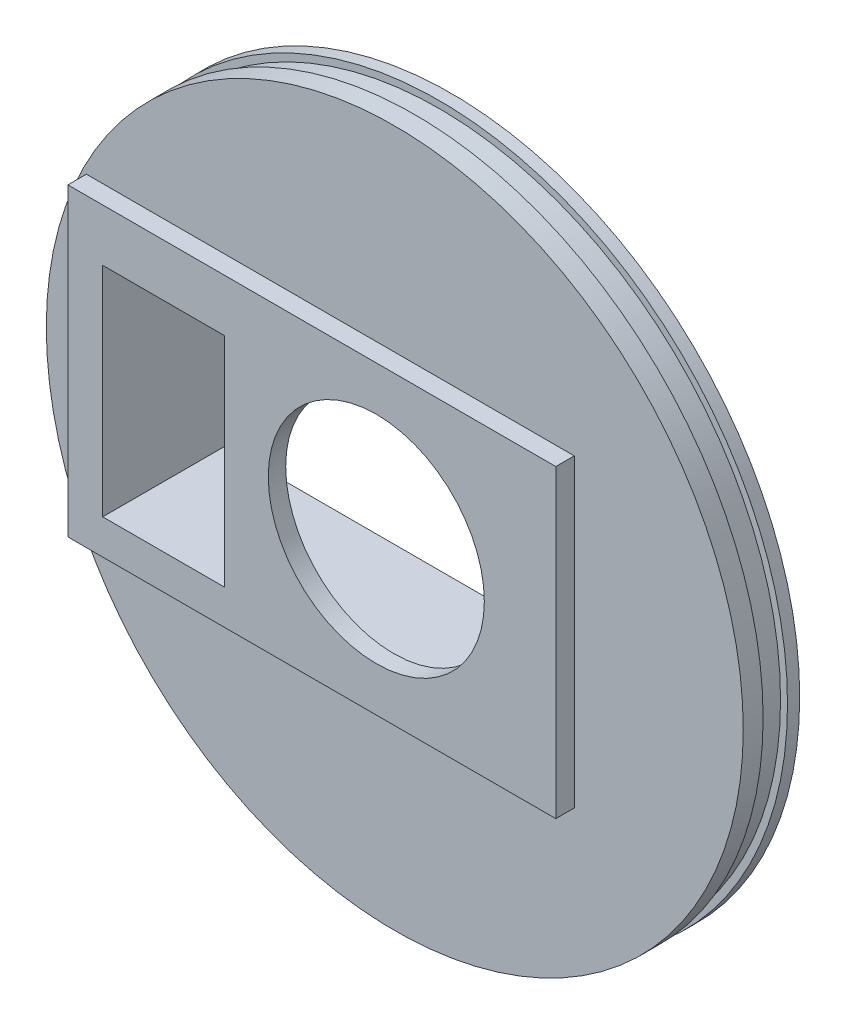
ISO-10303-21;
HEADER;
FILE_DESCRIPTION(('STEP AP214'),'2;1');
FILE_NAME('part.step','',(''),(''),'','','');
FILE_SCHEMA(('AUTOMOTIVE_DESIGN { 1 0 10303 214 1 1 1 1 }'));
ENDSEC;
DATA;
#1=APPLICATION_CONTEXT('core data for automotive mechanical design processes');
#2=APPLICATION_PROTOCOL_DEFINITION('international standard','automotive_design',2000,#1);
#3=PRODUCT_CONTEXT('',#1,'mechanical');
#4=PRODUCT('Part','Part','',(#3));
#5=PRODUCT_RELATED_PRODUCT_CATEGORY('part','',(#4));
#6=PRODUCT_DEFINITION_FORMATION('','',#4);
#7=PRODUCT_DEFINITION_CONTEXT('part definition',#1,'design');
#8=PRODUCT_DEFINITION('design','',#6,#7);
#9=PRODUCT_DEFINITION_SHAPE('','',#8);
#10=(LENGTH_UNIT() NAMED_UNIT(*) SI_UNIT(.MILLI.,.METRE.));
#11=(NAMED_UNIT(*) PLANE_ANGLE_UNIT() SI_UNIT($,.RADIAN.));
#12=(NAMED_UNIT(*) SI_UNIT($,.STERADIAN.) SOLID_ANGLE_UNIT());
#13=UNCERTAINTY_MEASURE_WITH_UNIT(LENGTH_MEASURE(1.E-05),#10,'distance_accuracy_value','');
#14=(GEOMETRIC_REPRESENTATION_CONTEXT(3) GLOBAL_UNCERTAINTY_ASSIGNED_CONTEXT((#13)) GLOBAL_UNIT_ASSIGNED_CONTEXT((#10,
#11,#12)) REPRESENTATION_CONTEXT('',''));
#15=CARTESIAN_POINT('',(0.,0.,0.));
#16=DIRECTION('',(0.,0.,1.));
#17=DIRECTION('',(1.,0.,0.));
#18=AXIS2_PLACEMENT_3D('',#15,#16,#17);
#19=CARTESIAN_POINT('',(0.,0.,-21.5));
#20=DIRECTION('',(0.,0.,1.));
#21=DIRECTION('',(1.,0.,0.));
#22=AXIS2_PLACEMENT_3D('',#19,#20,#21);
#23=CYLINDRICAL_SURFACE('',#22,100.);
#24=CARTESIAN_POINT('',(0.,0.,-5.3033009736835));
#25=DIRECTION('',(0.,0.,1.));
#26=DIRECTION('',(1.,0.,0.));
#27=AXIS2_PLACEMENT_3D('',#24,#25,#26);
#28=CIRCLE('',#27,100.);
#29=CARTESIAN_POINT('',(100.,0.,-5.3033009736835));
#30=VERTEX_POINT('',#29);
#31=EDGE_CURVE('E192',#30,#30,#28,.T.);
#32=CARTESIAN_POINT('',(0.,0.,-11.));
#33=DIRECTION('',(0.,0.,1.));
#34=DIRECTION('',(1.,0.,0.));
#35=AXIS2_PLACEMENT_3D('',#32,#33,#34);
#36=CIRCLE('',#35,100.);
#37=CARTESIAN_POINT('',(100.,0.,-11.));
#38=VERTEX_POINT('',#37);
#39=EDGE_CURVE('E471',#38,#38,#36,.T.);
#40=CARTESIAN_POINT('',(100.,0.,-5.3033009736835));
#41=CARTESIAN_POINT('',(100.,0.,-5.36264158854097));
#42=CARTESIAN_POINT('',(100.,0.,-5.42198220339843));
#43=CARTESIAN_POINT('',(100.,0.,-5.54066343311336));
#44=CARTESIAN_POINT('',(100.,0.,-5.60000404797082));
#45=CARTESIAN_POINT('',(100.,0.,-5.71868527768575));
#46=CARTESIAN_POINT('',(100.,0.,-5.77802589254321));
#47=CARTESIAN_POINT('',(100.,0.,-5.89670712225814));
#48=CARTESIAN_POINT('',(100.,0.,-5.9560477371156));
#49=CARTESIAN_POINT('',(100.,0.,-6.07472896683053));
#50=CARTESIAN_POINT('',(100.,0.,-6.13406958168799));
#51=CARTESIAN_POINT('',(100.,0.,-6.25275081140292));
#52=CARTESIAN_POINT('',(100.,0.,-6.31209142626038));
#53=CARTESIAN_POINT('',(100.,0.,-6.4307726559753));
#54=CARTESIAN_POINT('',(100.,0.,-6.49011327083277));
#55=CARTESIAN_POINT('',(100.,0.,-6.6087945005477));
#56=CARTESIAN_POINT('',(100.,0.,-6.66813511540516));
#57=CARTESIAN_POINT('',(100.,0.,-6.78681634512009));
#58=CARTESIAN_POINT('',(100.,0.,-6.84615695997755));
#59=CARTESIAN_POINT('',(100.,0.,-6.96483818969248));
#60=CARTESIAN_POINT('',(100.,0.,-7.02417880454994));
#61=CARTESIAN_POINT('',(100.,0.,-7.14286003426487));
#62=CARTESIAN_POINT('',(100.,0.,-7.20220064912233));
#63=CARTESIAN_POINT('',(100.,0.,-7.32088187883726));
#64=CARTESIAN_POINT('',(100.,0.,-7.38022249369472));
#65=CARTESIAN_POINT('',(100.,0.,-7.49890372340965));
#66=CARTESIAN_POINT('',(100.,0.,-7.55824433826711));
#67=CARTESIAN_POINT('',(100.,0.,-7.67692556798204));
#68=CARTESIAN_POINT('',(100.,0.,-7.7362661828395));
#69=CARTESIAN_POINT('',(100.,0.,-7.85494741255443));
#70=CARTESIAN_POINT('',(100.,0.,-7.91428802741189));
#71=CARTESIAN_POINT('',(100.,0.,-8.03296925712682));
#72=CARTESIAN_POINT('',(100.,0.,-8.09230987198428));
#73=CARTESIAN_POINT('',(100.,0.,-8.21099110169921));
#74=CARTESIAN_POINT('',(100.,0.,-8.27033171655667));
#75=CARTESIAN_POINT('',(100.,0.,-8.3890129462716));
#76=CARTESIAN_POINT('',(100.,0.,-8.44835356112906));
#77=CARTESIAN_POINT('',(100.,0.,-8.56703479084399));
#78=CARTESIAN_POINT('',(100.,0.,-8.62637540570145));
#79=CARTESIAN_POINT('',(100.,0.,-8.74505663541638));
#80=CARTESIAN_POINT('',(100.,0.,-8.80439725027384));
#81=CARTESIAN_POINT('',(100.,0.,-8.92307847998877));
#82=CARTESIAN_POINT('',(100.,0.,-8.98241909484623));
#83=CARTESIAN_POINT('',(100.,0.,-9.10110032456116));
#84=CARTESIAN_POINT('',(100.,0.,-9.16044093941862));
#85=CARTESIAN_POINT('',(100.,0.,-9.27912216913355));
#86=CARTESIAN_POINT('',(100.,0.,-9.33846278399101));
#87=CARTESIAN_POINT('',(100.,0.,-9.45714401370594));
#88=CARTESIAN_POINT('',(100.,0.,-9.5164846285634));
#89=CARTESIAN_POINT('',(100.,0.,-9.63516585827833));
#90=CARTESIAN_POINT('',(100.,0.,-9.69450647313579));
#91=CARTESIAN_POINT('',(100.,0.,-9.81318770285072));
#92=CARTESIAN_POINT('',(100.,0.,-9.87252831770818));
#93=CARTESIAN_POINT('',(100.,0.,-9.99120954742311));
#94=CARTESIAN_POINT('',(100.,0.,-10.0505501622806));
#95=CARTESIAN_POINT('',(100.,0.,-10.1692313919955));
#96=CARTESIAN_POINT('',(100.,0.,-10.228572006853));
#97=CARTESIAN_POINT('',(100.,0.,-10.3472532365679));
#98=CARTESIAN_POINT('',(100.,0.,-10.4065938514254));
#99=CARTESIAN_POINT('',(100.,0.,-10.5252750811403));
#100=CARTESIAN_POINT('',(100.,0.,-10.5846156959977));
#101=CARTESIAN_POINT('',(100.,0.,-10.7032969257127));
#102=CARTESIAN_POINT('',(100.,0.,-10.7626375405701));
#103=CARTESIAN_POINT('',(100.,0.,-10.8813187702851));
#104=CARTESIAN_POINT('',(100.,0.,-10.9406593851425));
#105=CARTESIAN_POINT('',(100.,0.,-11.));
#106=B_SPLINE_CURVE_WITH_KNOTS('',3,(#40,#41,#42,#43,#44,#45,#46,#47,#48,#49,#50,#51,#52,#53,
#54,#55,#56,#57,#58,#59,#60,#61,#62,#63,#64,#65,#66,#67,#68,#69,#70,#71,#72,#73,#74,#75,#76,#77,
#78,#79,#80,#81,#82,#83,#84,#85,#86,#87,#88,#89,#90,#91,#92,#93,#94,#95,#96,#97,#98,#99,#100,
#101,#102,#103,#104,#105),.UNSPECIFIED.,.F.,.F.,(4,2,2,2,2,2,2,2,2,2,2,2,2,2,2,2,2,2,2,2,2,2,2,
2,2,2,2,2,2,2,2,2,4),(0.,0.178021844572392,0.35604368914478,0.534065533717171,0.71208737828956,
0.890109222861949,1.06813106743434,1.24615291200673,1.42417475657912,1.60219660115151,
1.7802184457239,1.95824029029629,2.13626213486868,2.31428397944107,2.49230582401346,
2.67032766858585,2.84834951315824,3.02637135773063,3.20439320230302,3.38241504687541,
3.5604368914478,3.73845873602019,3.91648058059258,4.09450242516497,4.27252426973736,
4.45054611430975,4.62856795888214,4.80658980345453,4.98461164802692,5.16263349259931,
5.34065533717171,5.51867718174409,5.69669902631648),.UNSPECIFIED.);
#107=EDGE_CURVE('BSEAM37',#30,#38,#106,.T.);
#108=ORIENTED_EDGE('',*,*,#31,.F.);
#109=ORIENTED_EDGE('',*,*,#39,.T.);
#110=ORIENTED_EDGE('',*,*,#107,.T.);
#111=ORIENTED_EDGE('',*,*,#107,.F.);
#112=EDGE_LOOP('',(#108,#110,#109,#111));
#113=FACE_BOUND('',#112,.T.);
#114=ADVANCED_FACE('F37',(#113),#23,.T.);
#115=CARTESIAN_POINT('',(0.,0.,-21.5));
#116=DIRECTION('',(0.,0.,1.));
#117=DIRECTION('',(1.,0.,0.));
#118=AXIS2_PLACEMENT_3D('',#115,#116,#117);
#119=CIRCLE('',#118,100.);
#120=CARTESIAN_POINT('',(100.,0.,-21.5));
#121=VERTEX_POINT('',#120);
#122=EDGE_CURVE('E208',#121,#121,#119,.T.);
#123=CARTESIAN_POINT('',(0.,0.,-18.));
#124=DIRECTION('',(0.,0.,1.));
#125=DIRECTION('',(1.,0.,0.));
#126=AXIS2_PLACEMENT_3D('',#123,#124,#125);
#127=CIRCLE('',#126,100.);
#128=CARTESIAN_POINT('',(100.,0.,-18.));
#129=VERTEX_POINT('',#128);
#130=EDGE_CURVE('E468',#129,#129,#127,.T.);
#131=CARTESIAN_POINT('',(100.,0.,-21.5));
#132=CARTESIAN_POINT('',(100.,0.,-21.4635416666667));
#133=CARTESIAN_POINT('',(100.,0.,-21.4270833333333));
#134=CARTESIAN_POINT('',(100.,0.,-21.3541666666667));
#135=CARTESIAN_POINT('',(100.,0.,-21.3177083333333));
#136=CARTESIAN_POINT('',(100.,0.,-21.2447916666667));
#137=CARTESIAN_POINT('',(100.,0.,-21.2083333333333));
#138=CARTESIAN_POINT('',(100.,0.,-21.1354166666667));
#139=CARTESIAN_POINT('',(100.,0.,-21.0989583333333));
#140=CARTESIAN_POINT('',(100.,0.,-21.0260416666667));
#141=CARTESIAN_POINT('',(100.,0.,-20.9895833333333));
#142=CARTESIAN_POINT('',(100.,0.,-20.9166666666667));
#143=CARTESIAN_POINT('',(100.,0.,-20.8802083333333));
#144=CARTESIAN_POINT('',(100.,0.,-20.8072916666667));
#145=CARTESIAN_POINT('',(100.,0.,-20.7708333333333));
#146=CARTESIAN_POINT('',(100.,0.,-20.6979166666667));
#147=CARTESIAN_POINT('',(100.,0.,-20.6614583333333));
#148=CARTESIAN_POINT('',(100.,0.,-20.5885416666667));
#149=CARTESIAN_POINT('',(100.,0.,-20.5520833333333));
#150=CARTESIAN_POINT('',(100.,0.,-20.4791666666667));
#151=CARTESIAN_POINT('',(100.,0.,-20.4427083333333));
#152=CARTESIAN_POINT('',(100.,0.,-20.3697916666667));
#153=CARTESIAN_POINT('',(100.,0.,-20.3333333333333));
#154=CARTESIAN_POINT('',(100.,0.,-20.2604166666667));
#155=CARTESIAN_POINT('',(100.,0.,-20.2239583333333));
#156=CARTESIAN_POINT('',(100.,0.,-20.1510416666667));
#157=CARTESIAN_POINT('',(100.,0.,-20.1145833333333));
#158=CARTESIAN_POINT('',(100.,0.,-20.0416666666667));
#159=CARTESIAN_POINT('',(100.,0.,-20.0052083333333));
#160=CARTESIAN_POINT('',(100.,0.,-19.9322916666667));
#161=CARTESIAN_POINT('',(100.,0.,-19.8958333333333));
#162=CARTESIAN_POINT('',(100.,0.,-19.8229166666667));
#163=CARTESIAN_POINT('',(100.,0.,-19.7864583333333));
#164=CARTESIAN_POINT('',(100.,0.,-19.7135416666667));
#165=CARTESIAN_POINT('',(100.,0.,-19.6770833333333));
#166=CARTESIAN_POINT('',(100.,0.,-19.6041666666667));
#167=CARTESIAN_POINT('',(100.,0.,-19.5677083333333));
#168=CARTESIAN_POINT('',(100.,0.,-19.4947916666667));
#169=CARTESIAN_POINT('',(100.,0.,-19.4583333333333));
#170=CARTESIAN_POINT('',(100.,0.,-19.3854166666667));
#171=CARTESIAN_POINT('',(100.,0.,-19.3489583333333));
#172=CARTESIAN_POINT('',(100.,0.,-19.2760416666667));
#173=CARTESIAN_POINT('',(100.,0.,-19.2395833333333));
#174=CARTESIAN_POINT('',(100.,0.,-19.1666666666667));
#175=CARTESIAN_POINT('',(100.,0.,-19.1302083333333));
#176=CARTESIAN_POINT('',(100.,0.,-19.0572916666667));
#177=CARTESIAN_POINT('',(100.,0.,-19.0208333333333));
#178=CARTESIAN_POINT('',(100.,0.,-18.9479166666667));
#179=CARTESIAN_POINT('',(100.,0.,-18.9114583333333));
#180=CARTESIAN_POINT('',(100.,0.,-18.8385416666667));
#181=CARTESIAN_POINT('',(100.,0.,-18.8020833333333));
#182=CARTESIAN_POINT('',(100.,0.,-18.7291666666667));
#183=CARTESIAN_POINT('',(100.,0.,-18.6927083333333));
#184=CARTESIAN_POINT('',(100.,0.,-18.6197916666667));
#185=CARTESIAN_POINT('',(100.,0.,-18.5833333333333));
#186=CARTESIAN_POINT('',(100.,0.,-18.5104166666667));
#187=CARTESIAN_POINT('',(100.,0.,-18.4739583333333));
#188=CARTESIAN_POINT('',(100.,0.,-18.4010416666667));
#189=CARTESIAN_POINT('',(100.,0.,-18.3645833333333));
#190=CARTESIAN_POINT('',(100.,0.,-18.2916666666667));
#191=CARTESIAN_POINT('',(100.,0.,-18.2552083333333));
#192=CARTESIAN_POINT('',(100.,0.,-18.1822916666667));
#193=CARTESIAN_POINT('',(100.,0.,-18.1458333333333));
#194=CARTESIAN_POINT('',(100.,0.,-18.0729166666667));
#195=CARTESIAN_POINT('',(100.,0.,-18.0364583333333));
#196=CARTESIAN_POINT('',(100.,0.,-18.));
#197=B_SPLINE_CURVE_WITH_KNOTS('',3,(#131,#132,#133,#134,#135,#136,#137,#138,#139,#140,#141,
#142,#143,#144,#145,#146,#147,#148,#149,#150,#151,#152,#153,#154,#155,#156,#157,#158,#159,#160,
#161,#162,#163,#164,#165,#166,#167,#168,#169,#170,#171,#172,#173,#174,#175,#176,#177,#178,#179,
#180,#181,#182,#183,#184,#185,#186,#187,#188,#189,#190,#191,#192,#193,#194,#195,#196),
.UNSPECIFIED.,.F.,.F.,(4,2,2,2,2,2,2,2,2,2,2,2,2,2,2,2,2,2,2,2,2,2,2,2,2,2,2,2,2,2,2,2,4),(0.,
0.109374999999998,0.21875,0.328124999999999,0.4375,0.546874999999999,0.656250000000001,
0.765624999999999,0.875000000000001,0.984375000000003,1.09375,1.203125,1.3125,1.421875,1.53125,
1.640625,1.75,1.859375,1.96875000000001,2.078125,2.18750000000001,2.296875,2.40625000000001,
2.515625,2.62500000000001,2.734375,2.84375000000001,2.95312500000001,3.06250000000001,
3.17187500000001,3.28125000000001,3.39062500000001,3.50000000000001),.UNSPECIFIED.);
#198=EDGE_CURVE('BSEAM373',#121,#129,#197,.T.);
#199=ORIENTED_EDGE('',*,*,#122,.T.);
#200=ORIENTED_EDGE('',*,*,#130,.F.);
#201=ORIENTED_EDGE('',*,*,#198,.T.);
#202=ORIENTED_EDGE('',*,*,#198,.F.);
#203=EDGE_LOOP('',(#199,#201,#200,#202));
#204=FACE_BOUND('',#203,.T.);
#205=ADVANCED_FACE('F373',(#204),#23,.T.);
#206=CARTESIAN_POINT('',(51.5,43.75,0.));
#207=DIRECTION('',(1.,0.,0.));
#208=DIRECTION('',(0.,1.,0.));
#209=AXIS2_PLACEMENT_3D('',#206,#207,#208);
#210=PLANE('',#209);
#211=DIRECTION('',(0.,1.,0.));
#212=VECTOR('',#211,1.);
#213=CARTESIAN_POINT('',(51.5,43.75,-21.5));
#214=LINE('',#213,#212);
#215=CARTESIAN_POINT('',(51.5,-38.75,-21.5));
#216=VERTEX_POINT('',#215);
#217=CARTESIAN_POINT('',(51.5,38.75,-21.5));
#218=VERTEX_POINT('',#217);
#219=EDGE_CURVE('E195',#216,#218,#214,.T.);
#220=ORIENTED_EDGE('',*,*,#219,.F.);
#221=DIRECTION('',(0.,0.,-1.));
#222=VECTOR('',#221,1.);
#223=CARTESIAN_POINT('',(51.5,-38.75,0.));
#224=LINE('',#223,#222);
#225=CARTESIAN_POINT('',(51.5,-38.75,-35.));
#226=VERTEX_POINT('',#225);
#227=EDGE_CURVE('E319',#216,#226,#224,.T.);
#228=ORIENTED_EDGE('',*,*,#227,.T.);
#229=DIRECTION('',(0.,-1.,0.));
#230=VECTOR('',#229,1.);
#231=CARTESIAN_POINT('',(51.5,43.75,-35.));
#232=LINE('',#231,#230);
#233=CARTESIAN_POINT('',(51.5,38.75,-35.));
#234=VERTEX_POINT('',#233);
#235=EDGE_CURVE('E223',#234,#226,#232,.T.);
#236=ORIENTED_EDGE('',*,*,#235,.F.);
#237=DIRECTION('',(0.,0.,-1.));
#238=VECTOR('',#237,1.);
#239=CARTESIAN_POINT('',(51.5,38.75,0.));
#240=LINE('',#239,#238);
#241=EDGE_CURVE('E52',#234,#218,#240,.F.);
#242=ORIENTED_EDGE('',*,*,#241,.T.);
#243=EDGE_LOOP('',(#220,#228,#236,#242));
#244=FACE_BOUND('',#243,.T.);
#245=ADVANCED_FACE('F348',(#244),#210,.T.);
#246=CARTESIAN_POINT('',(51.5,43.75,0.));
#247=DIRECTION('',(0.,1.,0.));
#248=DIRECTION('',(0.,0.,1.));
#249=AXIS2_PLACEMENT_3D('',#246,#247,#248);
#250=PLANE('',#249);
#251=DIRECTION('',(1.,0.,0.));
#252=VECTOR('',#251,1.);
#253=CARTESIAN_POINT('',(51.5,43.75,-35.));
#254=LINE('',#253,#252);
#255=CARTESIAN_POINT('',(-83.5,43.75,-35.));
#256=VERTEX_POINT('',#255);
#257=CARTESIAN_POINT('',(46.5,43.75,-35.));
#258=VERTEX_POINT('',#257);
#259=EDGE_CURVE('E232',#256,#258,#254,.T.);
#260=ORIENTED_EDGE('',*,*,#259,.F.);
#261=DIRECTION('',(0.,0.,-1.));
#262=VECTOR('',#261,1.);
#263=CARTESIAN_POINT('',(-83.5,43.75,0.));
#264=LINE('',#263,#262);
#265=CARTESIAN_POINT('',(-83.5,43.75,-21.5));
#266=VERTEX_POINT('',#265);
#267=EDGE_CURVE('E316',#256,#266,#264,.F.);
#268=ORIENTED_EDGE('',*,*,#267,.T.);
#269=DIRECTION('',(-1.,0.,0.));
#270=VECTOR('',#269,1.);
#271=CARTESIAN_POINT('',(51.5,43.75,-21.5));
#272=LINE('',#271,#270);
#273=CARTESIAN_POINT('',(46.5,43.75,-21.5));
#274=VERTEX_POINT('',#273);
#275=EDGE_CURVE('E200',#274,#266,#272,.T.);
#276=ORIENTED_EDGE('',*,*,#275,.F.);
#277=DIRECTION('',(0.,0.,-1.));
#278=VECTOR('',#277,1.);
#279=CARTESIAN_POINT('',(46.5,43.75,0.));
#280=LINE('',#279,#278);
#281=EDGE_CURVE('E313',#274,#258,#280,.T.);
#282=ORIENTED_EDGE('',*,*,#281,.T.);
#283=EDGE_LOOP('',(#260,#268,#276,#282));
#284=FACE_BOUND('',#283,.T.);
#285=ADVANCED_FACE('F344',(#284),#250,.T.);
#286=CARTESIAN_POINT('',(-88.5,43.75,0.));
#287=DIRECTION('',(-1.,0.,0.));
#288=DIRECTION('',(0.,0.,1.));
#289=AXIS2_PLACEMENT_3D('',#286,#287,#288);
#290=PLANE('',#289);
#291=DIRECTION('',(0.,1.,0.));
#292=VECTOR('',#291,1.);
#293=CARTESIAN_POINT('',(-88.5,43.75,-35.));
#294=LINE('',#293,#292);
#295=CARTESIAN_POINT('',(-88.5,-38.75,-35.));
#296=VERTEX_POINT('',#295);
#297=CARTESIAN_POINT('',(-88.5,38.75,-35.));
#298=VERTEX_POINT('',#297);
#299=EDGE_CURVE('E229',#296,#298,#294,.T.);
#300=ORIENTED_EDGE('',*,*,#299,.F.);
#301=DIRECTION('',(0.,0.,-1.));
#302=VECTOR('',#301,1.);
#303=CARTESIAN_POINT('',(-88.5,-38.75,0.));
#304=LINE('',#303,#302);
#305=CARTESIAN_POINT('',(-88.5,-38.75,-21.5));
#306=VERTEX_POINT('',#305);
#307=EDGE_CURVE('E311',#296,#306,#304,.F.);
#308=ORIENTED_EDGE('',*,*,#307,.T.);
#309=DIRECTION('',(0.,-1.,0.));
#310=VECTOR('',#309,1.);
#311=CARTESIAN_POINT('',(-88.5,43.75,-21.5));
#312=LINE('',#311,#310);
#313=CARTESIAN_POINT('',(-88.5,38.75,-21.5));
#314=VERTEX_POINT('',#313);
#315=EDGE_CURVE('E203',#314,#306,#312,.T.);
#316=ORIENTED_EDGE('',*,*,#315,.F.);
#317=DIRECTION('',(0.,0.,-1.));
#318=VECTOR('',#317,1.);
#319=CARTESIAN_POINT('',(-88.5,38.75,0.));
#320=LINE('',#319,#318);
#321=EDGE_CURVE('E308',#314,#298,#320,.T.);
#322=ORIENTED_EDGE('',*,*,#321,.T.);
#323=EDGE_LOOP('',(#300,#308,#316,#322));
#324=FACE_BOUND('',#323,.T.);
#325=ADVANCED_FACE('F336',(#324),#290,.T.);
#326=CARTESIAN_POINT('',(51.5,-43.75,0.));
#327=DIRECTION('',(0.,-1.,0.));
#328=DIRECTION('',(1.,0.,0.));
#329=AXIS2_PLACEMENT_3D('',#326,#327,#328);
#330=PLANE('',#329);
#331=DIRECTION('',(1.,0.,0.));
#332=VECTOR('',#331,1.);
#333=CARTESIAN_POINT('',(51.5,-43.75,-21.5));
#334=LINE('',#333,#332);
#335=CARTESIAN_POINT('',(-83.5,-43.75,-21.5));
#336=VERTEX_POINT('',#335);
#337=CARTESIAN_POINT('',(46.5,-43.75,-21.5));
#338=VERTEX_POINT('',#337);
#339=EDGE_CURVE('E206',#336,#338,#334,.T.);
#340=ORIENTED_EDGE('',*,*,#339,.F.);
#341=DIRECTION('',(0.,0.,-1.));
#342=VECTOR('',#341,1.);
#343=CARTESIAN_POINT('',(-83.5,-43.75,0.));
#344=LINE('',#343,#342);
#345=CARTESIAN_POINT('',(-83.5,-43.75,-35.));
#346=VERTEX_POINT('',#345);
#347=EDGE_CURVE('E297',#336,#346,#344,.T.);
#348=ORIENTED_EDGE('',*,*,#347,.T.);
#349=DIRECTION('',(-1.,0.,0.));
#350=VECTOR('',#349,1.);
#351=CARTESIAN_POINT('',(51.5,-43.75,-35.));
#352=LINE('',#351,#350);
#353=CARTESIAN_POINT('',(46.5,-43.75,-35.));
#354=VERTEX_POINT('',#353);
#355=EDGE_CURVE('E226',#354,#346,#352,.T.);
#356=ORIENTED_EDGE('',*,*,#355,.F.);
#357=DIRECTION('',(0.,0.,-1.));
#358=VECTOR('',#357,1.);
#359=CARTESIAN_POINT('',(46.5,-43.75,0.));
#360=LINE('',#359,#358);
#361=EDGE_CURVE('E292',#354,#338,#360,.F.);
#362=ORIENTED_EDGE('',*,*,#361,.T.);
#363=EDGE_LOOP('',(#340,#348,#356,#362));
#364=FACE_BOUND('',#363,.T.);
#365=ADVANCED_FACE('F356',(#364),#330,.T.);
#366=CARTESIAN_POINT('',(-43.5,28.75,-5.));
#367=DIRECTION('',(-1.,0.,0.));
#368=DIRECTION('',(0.,-1.,0.));
#369=AXIS2_PLACEMENT_3D('',#366,#367,#368);
#370=PLANE('',#369);
#371=DIRECTION('',(0.,-1.,0.));
#372=VECTOR('',#371,1.);
#373=CARTESIAN_POINT('',(-43.5,28.75,0.));
#374=LINE('',#373,#372);
#375=CARTESIAN_POINT('',(-43.5,28.75,0.));
#376=VERTEX_POINT('',#375);
#377=CARTESIAN_POINT('',(-43.5,-33.75,0.));
#378=VERTEX_POINT('',#377);
#379=EDGE_CURVE('E272',#376,#378,#374,.T.);
#380=ORIENTED_EDGE('',*,*,#379,.F.);
#381=DIRECTION('',(0.,0.,1.));
#382=VECTOR('',#381,1.);
#383=CARTESIAN_POINT('',(-43.5,28.75,-5.));
#384=LINE('',#383,#382);
#385=CARTESIAN_POINT('',(-43.5,28.75,-5.));
#386=VERTEX_POINT('',#385);
#387=EDGE_CURVE('E293',#386,#376,#384,.T.);
#388=ORIENTED_EDGE('',*,*,#387,.F.);
#389=DIRECTION('',(0.,-1.,0.));
#390=VECTOR('',#389,1.);
#391=CARTESIAN_POINT('',(-43.5,28.75,-5.));
#392=LINE('',#391,#390);
#393=CARTESIAN_POINT('',(-43.5,-33.75,-5.));
#394=VERTEX_POINT('',#393);
#395=EDGE_CURVE('E279',#386,#394,#392,.T.);
#396=ORIENTED_EDGE('',*,*,#395,.T.);
#397=DIRECTION('',(0.,0.,1.));
#398=VECTOR('',#397,1.);
#399=CARTESIAN_POINT('',(-43.5,-33.75,-5.));
#400=LINE('',#399,#398);
#401=EDGE_CURVE('E289',#394,#378,#400,.T.);
#402=ORIENTED_EDGE('',*,*,#401,.T.);
#403=EDGE_LOOP('',(#380,#388,#396,#402));
#404=FACE_BOUND('',#403,.T.);
#405=ADVANCED_FACE('F429',(#404),#370,.T.);
#406=CARTESIAN_POINT('',(-78.5,28.75,-5.));
#407=DIRECTION('',(0.,-1.,0.));
#408=DIRECTION('',(0.,0.,-1.));
#409=AXIS2_PLACEMENT_3D('',#406,#407,#408);
#410=PLANE('',#409);
#411=DIRECTION('',(1.,0.,0.));
#412=VECTOR('',#411,1.);
#413=CARTESIAN_POINT('',(-78.5,28.75,0.));
#414=LINE('',#413,#412);
#415=CARTESIAN_POINT('',(-78.5,28.75,0.));
#416=VERTEX_POINT('',#415);
#417=EDGE_CURVE('E266',#416,#376,#414,.T.);
#418=ORIENTED_EDGE('',*,*,#417,.F.);
#419=DIRECTION('',(0.,0.,1.));
#420=VECTOR('',#419,1.);
#421=CARTESIAN_POINT('',(-78.5,28.75,-5.));
#422=LINE('',#421,#420);
#423=CARTESIAN_POINT('',(-78.5,28.75,-5.));
#424=VERTEX_POINT('',#423);
#425=EDGE_CURVE('E284',#424,#416,#422,.T.);
#426=ORIENTED_EDGE('',*,*,#425,.F.);
#427=DIRECTION('',(1.,0.,0.));
#428=VECTOR('',#427,1.);
#429=CARTESIAN_POINT('',(-78.5,28.75,-5.));
#430=LINE('',#429,#428);
#431=EDGE_CURVE('E276',#424,#386,#430,.T.);
#432=ORIENTED_EDGE('',*,*,#431,.T.);
#433=ORIENTED_EDGE('',*,*,#387,.T.);
#434=EDGE_LOOP('',(#418,#426,#432,#433));
#435=FACE_BOUND('',#434,.T.);
#436=ADVANCED_FACE('F424',(#435),#410,.T.);
#437=CARTESIAN_POINT('',(0.,0.,-5.));
#438=DIRECTION('',(0.,0.,1.));
#439=DIRECTION('',(1.,0.,0.));
#440=AXIS2_PLACEMENT_3D('',#437,#438,#439);
#441=PLANE('',#440);
#442=CARTESIAN_POINT('',(0.,0.,-5.));
#443=DIRECTION('',(0.,0.,1.));
#444=DIRECTION('',(1.,0.,0.));
#445=AXIS2_PLACEMENT_3D('',#442,#443,#444);
#446=CIRCLE('',#445,31.);
#447=CARTESIAN_POINT('',(31.,0.,-5.));
#448=VERTEX_POINT('',#447);
#449=EDGE_CURVE('E263',#448,#448,#446,.T.);
#450=ORIENTED_EDGE('',*,*,#449,.T.);
#451=EDGE_LOOP('',(#450));
#452=FACE_BOUND('',#451,.T.);
#453=DIRECTION('',(0.,1.,0.));
#454=VECTOR('',#453,1.);
#455=CARTESIAN_POINT('',(41.5,33.75,-5.));
#456=LINE('',#455,#454);
#457=CARTESIAN_POINT('',(41.5,-33.75,-5.));
#458=VERTEX_POINT('',#457);
#459=CARTESIAN_POINT('',(41.5,33.75,-5.));
#460=VERTEX_POINT('',#459);
#461=EDGE_CURVE('E269',#458,#460,#456,.T.);
#462=ORIENTED_EDGE('',*,*,#461,.F.);
#463=DIRECTION('',(1.,0.,0.));
#464=VECTOR('',#463,1.);
#465=CARTESIAN_POINT('',(-43.5,-33.75,-5.));
#466=LINE('',#465,#464);
#467=EDGE_CURVE('E282',#394,#458,#466,.T.);
#468=ORIENTED_EDGE('',*,*,#467,.F.);
#469=ORIENTED_EDGE('',*,*,#395,.F.);
#470=ORIENTED_EDGE('',*,*,#431,.F.);
#471=DIRECTION('',(0.,-1.,0.));
#472=VECTOR('',#471,1.);
#473=CARTESIAN_POINT('',(-78.5,33.75,-5.));
#474=LINE('',#473,#472);
#475=CARTESIAN_POINT('',(-78.5,33.75,-5.));
#476=VERTEX_POINT('',#475);
#477=EDGE_CURVE('E274',#476,#424,#474,.T.);
#478=ORIENTED_EDGE('',*,*,#477,.F.);
#479=DIRECTION('',(-1.,0.,0.));
#480=VECTOR('',#479,1.);
#481=CARTESIAN_POINT('',(41.5,33.75,-5.));
#482=LINE('',#481,#480);
#483=EDGE_CURVE('E271',#460,#476,#482,.T.);
#484=ORIENTED_EDGE('',*,*,#483,.F.);
#485=EDGE_LOOP('',(#462,#468,#469,#470,#478,#484));
#486=FACE_BOUND('',#485,.T.);
#487=ADVANCED_FACE('F421',(#452,#486),#441,.F.);
#488=CARTESIAN_POINT('',(0.,0.,0.));
#489=DIRECTION('',(0.,0.,1.));
#490=DIRECTION('',(1.,0.,0.));
#491=AXIS2_PLACEMENT_3D('',#488,#489,#490);
#492=PLANE('',#491);
#493=DIRECTION('',(0.,1.,0.));
#494=VECTOR('',#493,1.);
#495=CARTESIAN_POINT('',(-78.5,33.75,0.));
#496=LINE('',#495,#494);
#497=CARTESIAN_POINT('',(-78.5,-33.75,0.));
#498=VERTEX_POINT('',#497);
#499=EDGE_CURVE('E237',#498,#416,#496,.T.);
#500=ORIENTED_EDGE('',*,*,#499,.T.);
#501=ORIENTED_EDGE('',*,*,#417,.T.);
#502=ORIENTED_EDGE('',*,*,#379,.T.);
#503=DIRECTION('',(-1.,0.,0.));
#504=VECTOR('',#503,1.);
#505=CARTESIAN_POINT('',(-78.5,-33.75,0.));
#506=LINE('',#505,#504);
#507=EDGE_CURVE('E235',#378,#498,#506,.T.);
#508=ORIENTED_EDGE('',*,*,#507,.T.);
#509=EDGE_LOOP('',(#500,#501,#502,#508));
#510=FACE_BOUND('',#509,.T.);
#511=CARTESIAN_POINT('',(0.,0.,0.));
#512=DIRECTION('',(0.,0.,1.));
#513=DIRECTION('',(1.,0.,0.));
#514=AXIS2_PLACEMENT_3D('',#511,#512,#513);
#515=CIRCLE('',#514,31.);
#516=CARTESIAN_POINT('',(31.,0.,0.));
#517=VERTEX_POINT('',#516);
#518=EDGE_CURVE('E260',#517,#517,#515,.T.);
#519=ORIENTED_EDGE('',*,*,#518,.F.);
#520=EDGE_LOOP('',(#519));
#521=FACE_BOUND('',#520,.T.);
#522=DIRECTION('',(0.,-1.,0.));
#523=VECTOR('',#522,1.);
#524=CARTESIAN_POINT('',(51.5,43.75,0.));
#525=LINE('',#524,#523);
#526=CARTESIAN_POINT('',(51.5,43.75,0.));
#527=VERTEX_POINT('',#526);
#528=CARTESIAN_POINT('',(51.5,-43.75,0.));
#529=VERTEX_POINT('',#528);
#530=EDGE_CURVE('E243',#527,#529,#525,.T.);
#531=ORIENTED_EDGE('',*,*,#530,.F.);
#532=DIRECTION('',(1.,0.,0.));
#533=VECTOR('',#532,1.);
#534=CARTESIAN_POINT('',(51.5,43.75,0.));
#535=LINE('',#534,#533);
#536=CARTESIAN_POINT('',(-88.5,43.75,0.));
#537=VERTEX_POINT('',#536);
#538=EDGE_CURVE('E254',#537,#527,#535,.T.);
#539=ORIENTED_EDGE('',*,*,#538,.F.);
#540=DIRECTION('',(0.,1.,0.));
#541=VECTOR('',#540,1.);
#542=CARTESIAN_POINT('',(-88.5,43.75,0.));
#543=LINE('',#542,#541);
#544=CARTESIAN_POINT('',(-88.5,-43.75,0.));
#545=VERTEX_POINT('',#544);
#546=EDGE_CURVE('E252',#545,#537,#543,.T.);
#547=ORIENTED_EDGE('',*,*,#546,.F.);
#548=DIRECTION('',(-1.,0.,0.));
#549=VECTOR('',#548,1.);
#550=CARTESIAN_POINT('',(51.5,-43.75,0.));
#551=LINE('',#550,#549);
#552=EDGE_CURVE('E174',#529,#545,#551,.T.);
#553=ORIENTED_EDGE('',*,*,#552,.F.);
#554=EDGE_LOOP('',(#531,#539,#547,#553));
#555=FACE_BOUND('',#554,.T.);
#556=ADVANCED_FACE('F419',(#510,#521,#555),#492,.T.);
#557=CARTESIAN_POINT('',(0.,0.,-5.));
#558=DIRECTION('',(0.,0.,1.));
#559=DIRECTION('',(1.,0.,0.));
#560=AXIS2_PLACEMENT_3D('',#557,#558,#559);
#561=CYLINDRICAL_SURFACE('',#560,31.);
#562=ORIENTED_EDGE('',*,*,#449,.F.);
#563=EDGE_LOOP('',(#562));
#564=FACE_BOUND('',#563,.T.);
#565=ORIENTED_EDGE('',*,*,#518,.T.);
#566=EDGE_LOOP('',(#565));
#567=FACE_BOUND('',#566,.T.);
#568=ADVANCED_FACE('F404',(#564,#567),#561,.F.);
#569=CARTESIAN_POINT('',(41.5,-33.75,0.));
#570=DIRECTION('',(1.,0.,0.));
#571=DIRECTION('',(0.,1.,0.));
#572=AXIS2_PLACEMENT_3D('',#569,#570,#571);
#573=PLANE('',#572);
#574=DIRECTION('',(0.,0.,-1.));
#575=VECTOR('',#574,1.);
#576=CARTESIAN_POINT('',(41.5,-33.75,0.));
#577=LINE('',#576,#575);
#578=CARTESIAN_POINT('',(41.5,-33.75,-35.));
#579=VERTEX_POINT('',#578);
#580=EDGE_CURVE('E240',#458,#579,#577,.T.);
#581=ORIENTED_EDGE('',*,*,#580,.F.);
#582=ORIENTED_EDGE('',*,*,#461,.T.);
#583=DIRECTION('',(0.,0.,-1.));
#584=VECTOR('',#583,1.);
#585=CARTESIAN_POINT('',(41.5,33.75,0.));
#586=LINE('',#585,#584);
#587=CARTESIAN_POINT('',(41.5,33.75,-35.));
#588=VERTEX_POINT('',#587);
#589=EDGE_CURVE('E241',#460,#588,#586,.T.);
#590=ORIENTED_EDGE('',*,*,#589,.T.);
#591=DIRECTION('',(0.,-1.,0.));
#592=VECTOR('',#591,1.);
#593=CARTESIAN_POINT('',(41.5,-33.75,-35.));
#594=LINE('',#593,#592);
#595=EDGE_CURVE('E211',#588,#579,#594,.T.);
#596=ORIENTED_EDGE('',*,*,#595,.T.);
#597=EDGE_LOOP('',(#581,#582,#590,#596));
#598=FACE_BOUND('',#597,.T.);
#599=ADVANCED_FACE('F393',(#598),#573,.F.);
#600=CARTESIAN_POINT('',(41.5,33.75,0.));
#601=DIRECTION('',(0.,1.,0.));
#602=DIRECTION('',(-1.,0.,0.));
#603=AXIS2_PLACEMENT_3D('',#600,#601,#602);
#604=PLANE('',#603);
#605=ORIENTED_EDGE('',*,*,#589,.F.);
#606=ORIENTED_EDGE('',*,*,#483,.T.);
#607=DIRECTION('',(0.,0.,-1.));
#608=VECTOR('',#607,1.);
#609=CARTESIAN_POINT('',(-78.5,33.75,0.));
#610=LINE('',#609,#608);
#611=CARTESIAN_POINT('',(-78.5,33.75,-35.));
#612=VERTEX_POINT('',#611);
#613=EDGE_CURVE('E244',#476,#612,#610,.T.);
#614=ORIENTED_EDGE('',*,*,#613,.T.);
#615=DIRECTION('',(1.,0.,0.));
#616=VECTOR('',#615,1.);
#617=CARTESIAN_POINT('',(41.5,33.75,-35.));
#618=LINE('',#617,#616);
#619=EDGE_CURVE('E220',#612,#588,#618,.T.);
#620=ORIENTED_EDGE('',*,*,#619,.T.);
#621=EDGE_LOOP('',(#605,#606,#614,#620));
#622=FACE_BOUND('',#621,.T.);
#623=ADVANCED_FACE('F389',(#622),#604,.F.);
#624=DIRECTION('',(0.,1.,0.));
#625=VECTOR('',#624,1.);
#626=CARTESIAN_POINT('',(51.5,43.75,-5.3033009736835));
#627=LINE('',#626,#625);
#628=CARTESIAN_POINT('',(51.5,-43.75,-5.3033009736835));
#629=VERTEX_POINT('',#628);
#630=CARTESIAN_POINT('',(51.5,43.75,-5.3033009736835));
#631=VERTEX_POINT('',#630);
#632=EDGE_CURVE('E191',#629,#631,#627,.T.);
#633=ORIENTED_EDGE('',*,*,#632,.T.);
#634=DIRECTION('',(0.,0.,-1.));
#635=VECTOR('',#634,1.);
#636=CARTESIAN_POINT('',(51.5,43.75,0.));
#637=LINE('',#636,#635);
#638=EDGE_CURVE('E257',#527,#631,#637,.T.);
#639=ORIENTED_EDGE('',*,*,#638,.F.);
#640=ORIENTED_EDGE('',*,*,#530,.T.);
#641=DIRECTION('',(0.,0.,-1.));
#642=VECTOR('',#641,1.);
#643=CARTESIAN_POINT('',(51.5,-43.75,0.));
#644=LINE('',#643,#642);
#645=EDGE_CURVE('E179',#529,#629,#644,.T.);
#646=ORIENTED_EDGE('',*,*,#645,.T.);
#647=EDGE_LOOP('',(#633,#639,#640,#646));
#648=FACE_BOUND('',#647,.T.);
#649=ADVANCED_FACE('F392',(#648),#210,.T.);
#650=DIRECTION('',(-1.,0.,0.));
#651=VECTOR('',#650,1.);
#652=CARTESIAN_POINT('',(51.5,43.75,-5.3033009736835));
#653=LINE('',#652,#651);
#654=CARTESIAN_POINT('',(-88.5,43.75,-5.3033009736835));
#655=VERTEX_POINT('',#654);
#656=EDGE_CURVE('E187',#631,#655,#653,.T.);
#657=ORIENTED_EDGE('',*,*,#656,.T.);
#658=DIRECTION('',(0.,0.,-1.));
#659=VECTOR('',#658,1.);
#660=CARTESIAN_POINT('',(-88.5,43.75,0.));
#661=LINE('',#660,#659);
#662=EDGE_CURVE('E178',#537,#655,#661,.T.);
#663=ORIENTED_EDGE('',*,*,#662,.F.);
#664=ORIENTED_EDGE('',*,*,#538,.T.);
#665=ORIENTED_EDGE('',*,*,#638,.T.);
#666=EDGE_LOOP('',(#657,#663,#664,#665));
#667=FACE_BOUND('',#666,.T.);
#668=ADVANCED_FACE('F406',(#667),#250,.T.);
#669=DIRECTION('',(0.,-1.,0.));
#670=VECTOR('',#669,1.);
#671=CARTESIAN_POINT('',(-88.5,43.75,-5.3033009736835));
#672=LINE('',#671,#670);
#673=CARTESIAN_POINT('',(-88.5,-43.75,-5.3033009736835));
#674=VERTEX_POINT('',#673);
#675=EDGE_CURVE('E183',#655,#674,#672,.T.);
#676=ORIENTED_EDGE('',*,*,#675,.T.);
#677=DIRECTION('',(0.,0.,-1.));
#678=VECTOR('',#677,1.);
#679=CARTESIAN_POINT('',(-88.5,-43.75,0.));
#680=LINE('',#679,#678);
#681=EDGE_CURVE('E167',#545,#674,#680,.T.);
#682=ORIENTED_EDGE('',*,*,#681,.F.);
#683=ORIENTED_EDGE('',*,*,#546,.T.);
#684=ORIENTED_EDGE('',*,*,#662,.T.);
#685=EDGE_LOOP('',(#676,#682,#683,#684));
#686=FACE_BOUND('',#685,.T.);
#687=ADVANCED_FACE('F184',(#686),#290,.T.);
#688=DIRECTION('',(1.,0.,0.));
#689=VECTOR('',#688,1.);
#690=CARTESIAN_POINT('',(51.5,-43.75,-5.3033009736835));
#691=LINE('',#690,#689);
#692=EDGE_CURVE('E171',#674,#629,#691,.T.);
#693=ORIENTED_EDGE('',*,*,#692,.T.);
#694=ORIENTED_EDGE('',*,*,#645,.F.);
#695=ORIENTED_EDGE('',*,*,#552,.T.);
#696=ORIENTED_EDGE('',*,*,#681,.T.);
#697=EDGE_LOOP('',(#693,#694,#695,#696));
#698=FACE_BOUND('',#697,.T.);
#699=ADVANCED_FACE('F169',(#698),#330,.T.);
#700=CARTESIAN_POINT('',(-78.5,33.75,0.));
#701=DIRECTION('',(-1.,0.,0.));
#702=DIRECTION('',(0.,-1.,0.));
#703=AXIS2_PLACEMENT_3D('',#700,#701,#702);
#704=PLANE('',#703);
#705=ORIENTED_EDGE('',*,*,#425,.T.);
#706=ORIENTED_EDGE('',*,*,#499,.F.);
#707=DIRECTION('',(0.,0.,-1.));
#708=VECTOR('',#707,1.);
#709=CARTESIAN_POINT('',(-78.5,-33.75,0.));
#710=LINE('',#709,#708);
#711=CARTESIAN_POINT('',(-78.5,-33.75,-35.));
#712=VERTEX_POINT('',#711);
#713=EDGE_CURVE('E246',#498,#712,#710,.T.);
#714=ORIENTED_EDGE('',*,*,#713,.T.);
#715=DIRECTION('',(0.,1.,0.));
#716=VECTOR('',#715,1.);
#717=CARTESIAN_POINT('',(-78.5,33.75,-35.));
#718=LINE('',#717,#716);
#719=EDGE_CURVE('E217',#712,#612,#718,.T.);
#720=ORIENTED_EDGE('',*,*,#719,.T.);
#721=ORIENTED_EDGE('',*,*,#613,.F.);
#722=ORIENTED_EDGE('',*,*,#477,.T.);
#723=EDGE_LOOP('',(#705,#706,#714,#720,#721,#722));
#724=FACE_BOUND('',#723,.T.);
#725=ADVANCED_FACE('F395',(#724),#704,.F.);
#726=CARTESIAN_POINT('',(-78.5,-33.75,0.));
#727=DIRECTION('',(0.,-1.,0.));
#728=DIRECTION('',(1.,0.,0.));
#729=AXIS2_PLACEMENT_3D('',#726,#727,#728);
#730=PLANE('',#729);
#731=ORIENTED_EDGE('',*,*,#401,.F.);
#732=ORIENTED_EDGE('',*,*,#467,.T.);
#733=ORIENTED_EDGE('',*,*,#580,.T.);
#734=DIRECTION('',(-1.,0.,0.));
#735=VECTOR('',#734,1.);
#736=CARTESIAN_POINT('',(-78.5,-33.75,-35.));
#737=LINE('',#736,#735);
#738=EDGE_CURVE('E214',#579,#712,#737,.T.);
#739=ORIENTED_EDGE('',*,*,#738,.T.);
#740=ORIENTED_EDGE('',*,*,#713,.F.);
#741=ORIENTED_EDGE('',*,*,#507,.F.);
#742=EDGE_LOOP('',(#731,#732,#733,#739,#740,#741));
#743=FACE_BOUND('',#742,.T.);
#744=ADVANCED_FACE('F387',(#743),#730,.F.);
#745=CARTESIAN_POINT('',(0.,0.,-35.));
#746=DIRECTION('',(0.,0.,-1.));
#747=DIRECTION('',(-1.,0.,0.));
#748=AXIS2_PLACEMENT_3D('',#745,#746,#747);
#749=PLANE('',#748);
#750=CARTESIAN_POINT('',(-83.5,38.75,-35.));
#751=DIRECTION('',(0.,0.,-1.));
#752=DIRECTION('',(-1.,0.,0.));
#753=AXIS2_PLACEMENT_3D('',#750,#751,#752);
#754=CIRCLE('',#753,1.5);
#755=CARTESIAN_POINT('',(-85.,38.75,-35.));
#756=VERTEX_POINT('',#755);
#757=EDGE_CURVE('E481',#756,#756,#754,.T.);
#758=ORIENTED_EDGE('',*,*,#757,.F.);
#759=EDGE_LOOP('',(#758));
#760=FACE_BOUND('',#759,.T.);
#761=CARTESIAN_POINT('',(-83.5,-38.75,-35.));
#762=DIRECTION('',(0.,0.,-1.));
#763=DIRECTION('',(-1.,0.,0.));
#764=AXIS2_PLACEMENT_3D('',#761,#762,#763);
#765=CIRCLE('',#764,1.5);
#766=CARTESIAN_POINT('',(-85.,-38.75,-35.));
#767=VERTEX_POINT('',#766);
#768=EDGE_CURVE('E487',#767,#767,#765,.T.);
#769=ORIENTED_EDGE('',*,*,#768,.F.);
#770=EDGE_LOOP('',(#769));
#771=FACE_BOUND('',#770,.T.);
#772=CARTESIAN_POINT('',(46.5,-38.75,-35.));
#773=DIRECTION('',(0.,0.,-1.));
#774=DIRECTION('',(-1.,0.,0.));
#775=AXIS2_PLACEMENT_3D('',#772,#773,#774);
#776=CIRCLE('',#775,1.5);
#777=CARTESIAN_POINT('',(45.,-38.75,-35.));
#778=VERTEX_POINT('',#777);
#779=EDGE_CURVE('E493',#778,#778,#776,.T.);
#780=ORIENTED_EDGE('',*,*,#779,.F.);
#781=EDGE_LOOP('',(#780));
#782=FACE_BOUND('',#781,.T.);
#783=CARTESIAN_POINT('',(46.5,38.75,-35.));
#784=DIRECTION('',(0.,0.,-1.));
#785=DIRECTION('',(-1.,0.,0.));
#786=AXIS2_PLACEMENT_3D('',#783,#784,#785);
#787=CIRCLE('',#786,1.5);
#788=CARTESIAN_POINT('',(45.,38.75,-35.));
#789=VERTEX_POINT('',#788);
#790=EDGE_CURVE('E475',#789,#789,#787,.T.);
#791=ORIENTED_EDGE('',*,*,#790,.F.);
#792=EDGE_LOOP('',(#791));
#793=FACE_BOUND('',#792,.T.);
#794=ORIENTED_EDGE('',*,*,#355,.T.);
#795=CARTESIAN_POINT('',(-83.5,-38.75,-35.));
#796=DIRECTION('',(0.,0.,-1.));
#797=DIRECTION('',(-1.,0.,0.));
#798=AXIS2_PLACEMENT_3D('',#795,#796,#797);
#799=CIRCLE('',#798,5.);
#800=EDGE_CURVE('E306',#346,#296,#799,.T.);
#801=ORIENTED_EDGE('',*,*,#800,.T.);
#802=ORIENTED_EDGE('',*,*,#299,.T.);
#803=CARTESIAN_POINT('',(-83.5,38.75,-35.));
#804=DIRECTION('',(0.,0.,-1.));
#805=DIRECTION('',(-1.,0.,0.));
#806=AXIS2_PLACEMENT_3D('',#803,#804,#805);
#807=CIRCLE('',#806,5.);
#808=EDGE_CURVE('E304',#298,#256,#807,.T.);
#809=ORIENTED_EDGE('',*,*,#808,.T.);
#810=ORIENTED_EDGE('',*,*,#259,.T.);
#811=CARTESIAN_POINT('',(46.5,38.75,-35.));
#812=DIRECTION('',(0.,0.,-1.));
#813=DIRECTION('',(-1.,0.,0.));
#814=AXIS2_PLACEMENT_3D('',#811,#812,#813);
#815=CIRCLE('',#814,5.);
#816=EDGE_CURVE('E300',#258,#234,#815,.T.);
#817=ORIENTED_EDGE('',*,*,#816,.T.);
#818=ORIENTED_EDGE('',*,*,#235,.T.);
#819=CARTESIAN_POINT('',(46.5,-38.75,-35.));
#820=DIRECTION('',(0.,0.,-1.));
#821=DIRECTION('',(-1.,0.,0.));
#822=AXIS2_PLACEMENT_3D('',#819,#820,#821);
#823=CIRCLE('',#822,5.);
#824=EDGE_CURVE('E302',#226,#354,#823,.T.);
#825=ORIENTED_EDGE('',*,*,#824,.T.);
#826=EDGE_LOOP('',(#794,#801,#802,#809,#810,#817,#818,#825));
#827=FACE_BOUND('',#826,.T.);
#828=ORIENTED_EDGE('',*,*,#738,.F.);
#829=ORIENTED_EDGE('',*,*,#595,.F.);
#830=ORIENTED_EDGE('',*,*,#619,.F.);
#831=ORIENTED_EDGE('',*,*,#719,.F.);
#832=EDGE_LOOP('',(#828,#829,#830,#831));
#833=FACE_BOUND('',#832,.T.);
#834=ADVANCED_FACE('F341',(#760,#771,#782,#793,#827,#833),#749,.T.);
#835=CARTESIAN_POINT('',(0.,0.,-21.5));
#836=DIRECTION('',(0.,0.,1.));
#837=DIRECTION('',(1.,0.,0.));
#838=AXIS2_PLACEMENT_3D('',#835,#836,#837);
#839=PLANE('',#838);
#840=ORIENTED_EDGE('',*,*,#315,.T.);
#841=CARTESIAN_POINT('',(-83.5,-38.75,-21.5));
#842=DIRECTION('',(0.,0.,1.));
#843=DIRECTION('',(1.,0.,0.));
#844=AXIS2_PLACEMENT_3D('',#841,#842,#843);
#845=CIRCLE('',#844,5.);
#846=EDGE_CURVE('E322',#306,#336,#845,.T.);
#847=ORIENTED_EDGE('',*,*,#846,.T.);
#848=ORIENTED_EDGE('',*,*,#339,.T.);
#849=CARTESIAN_POINT('',(46.5,-38.75,-21.5));
#850=DIRECTION('',(0.,0.,1.));
#851=DIRECTION('',(1.,0.,0.));
#852=AXIS2_PLACEMENT_3D('',#849,#850,#851);
#853=CIRCLE('',#852,5.);
#854=EDGE_CURVE('E45',#338,#216,#853,.T.);
#855=ORIENTED_EDGE('',*,*,#854,.T.);
#856=ORIENTED_EDGE('',*,*,#219,.T.);
#857=CARTESIAN_POINT('',(46.5,38.75,-21.5));
#858=DIRECTION('',(0.,0.,1.));
#859=DIRECTION('',(1.,0.,0.));
#860=AXIS2_PLACEMENT_3D('',#857,#858,#859);
#861=CIRCLE('',#860,5.);
#862=EDGE_CURVE('E11',#218,#274,#861,.T.);
#863=ORIENTED_EDGE('',*,*,#862,.T.);
#864=ORIENTED_EDGE('',*,*,#275,.T.);
#865=CARTESIAN_POINT('',(-83.5,38.75,-21.5));
#866=DIRECTION('',(0.,0.,1.));
#867=DIRECTION('',(1.,0.,0.));
#868=AXIS2_PLACEMENT_3D('',#865,#866,#867);
#869=CIRCLE('',#868,5.);
#870=EDGE_CURVE('E324',#266,#314,#869,.T.);
#871=ORIENTED_EDGE('',*,*,#870,.T.);
#872=EDGE_LOOP('',(#840,#847,#848,#855,#856,#863,#864,#871));
#873=FACE_BOUND('',#872,.T.);
#874=ORIENTED_EDGE('',*,*,#122,.F.);
#875=EDGE_LOOP('',(#874));
#876=FACE_BOUND('',#875,.T.);
#877=ADVANCED_FACE('F327',(#873,#876),#839,.F.);
#878=CARTESIAN_POINT('',(0.,0.,-5.3033009736835));
#879=DIRECTION('',(0.,0.,1.));
#880=DIRECTION('',(1.,0.,0.));
#881=AXIS2_PLACEMENT_3D('',#878,#879,#880);
#882=PLANE('',#881);
#883=ORIENTED_EDGE('',*,*,#31,.T.);
#884=EDGE_LOOP('',(#883));
#885=FACE_BOUND('',#884,.T.);
#886=ORIENTED_EDGE('',*,*,#656,.F.);
#887=ORIENTED_EDGE('',*,*,#632,.F.);
#888=ORIENTED_EDGE('',*,*,#692,.F.);
#889=ORIENTED_EDGE('',*,*,#675,.F.);
#890=EDGE_LOOP('',(#886,#887,#888,#889));
#891=FACE_BOUND('',#890,.T.);
#892=ADVANCED_FACE('F190',(#885,#891),#882,.T.);
#893=CARTESIAN_POINT('',(0.,100.,-11.));
#894=DIRECTION('',(0.,0.,-1.));
#895=DIRECTION('',(-1.,0.,0.));
#896=AXIS2_PLACEMENT_3D('',#893,#894,#895);
#897=PLANE('',#896);
#898=CARTESIAN_POINT('',(0.,0.,-11.));
#899=DIRECTION('',(0.,0.,1.));
#900=DIRECTION('',(1.,0.,0.));
#901=AXIS2_PLACEMENT_3D('',#898,#899,#900);
#902=CIRCLE('',#901,98.);
#903=CARTESIAN_POINT('',(98.,0.,-11.));
#904=VERTEX_POINT('',#903);
#905=EDGE_CURVE('E460',#904,#904,#902,.T.);
#906=ORIENTED_EDGE('',*,*,#905,.T.);
#907=EDGE_LOOP('',(#906));
#908=FACE_BOUND('',#907,.T.);
#909=ORIENTED_EDGE('',*,*,#39,.F.);
#910=EDGE_LOOP('',(#909));
#911=FACE_BOUND('',#910,.T.);
#912=ADVANCED_FACE('F526',(#908,#911),#897,.T.);
#913=CARTESIAN_POINT('',(0.,0.,0.));
#914=DIRECTION('',(0.,0.,1.));
#915=DIRECTION('',(1.,0.,0.));
#916=AXIS2_PLACEMENT_3D('',#913,#914,#915);
#917=CYLINDRICAL_SURFACE('',#916,98.);
#918=CARTESIAN_POINT('',(0.,0.,-18.));
#919=DIRECTION('',(0.,0.,1.));
#920=DIRECTION('',(1.,0.,0.));
#921=AXIS2_PLACEMENT_3D('',#918,#919,#920);
#922=CIRCLE('',#921,98.);
#923=CARTESIAN_POINT('',(98.,0.,-18.));
#924=VERTEX_POINT('',#923);
#925=EDGE_CURVE('E465',#924,#924,#922,.T.);
#926=ORIENTED_EDGE('',*,*,#925,.T.);
#927=EDGE_LOOP('',(#926));
#928=FACE_BOUND('',#927,.T.);
#929=ORIENTED_EDGE('',*,*,#905,.F.);
#930=EDGE_LOOP('',(#929));
#931=FACE_BOUND('',#930,.T.);
#932=ADVANCED_FACE('F368',(#928,#931),#917,.T.);
#933=CARTESIAN_POINT('',(0.,100.,-18.));
#934=DIRECTION('',(0.,0.,1.));
#935=DIRECTION('',(1.,0.,0.));
#936=AXIS2_PLACEMENT_3D('',#933,#934,#935);
#937=PLANE('',#936);
#938=ORIENTED_EDGE('',*,*,#130,.T.);
#939=EDGE_LOOP('',(#938));
#940=FACE_BOUND('',#939,.T.);
#941=ORIENTED_EDGE('',*,*,#925,.F.);
#942=EDGE_LOOP('',(#941));
#943=FACE_BOUND('',#942,.T.);
#944=ADVANCED_FACE('F361',(#940,#943),#937,.T.);
#945=CARTESIAN_POINT('',(-83.5,-38.75,0.));
#946=DIRECTION('',(0.,0.,-1.));
#947=DIRECTION('',(-1.,0.,0.));
#948=AXIS2_PLACEMENT_3D('',#945,#946,#947);
#949=CYLINDRICAL_SURFACE('',#948,5.);
#950=ORIENTED_EDGE('',*,*,#846,.F.);
#951=ORIENTED_EDGE('',*,*,#307,.F.);
#952=ORIENTED_EDGE('',*,*,#800,.F.);
#953=ORIENTED_EDGE('',*,*,#347,.F.);
#954=EDGE_LOOP('',(#950,#951,#952,#953));
#955=FACE_BOUND('',#954,.T.);
#956=ADVANCED_FACE('F359',(#955),#949,.T.);
#957=CARTESIAN_POINT('',(-83.5,38.75,0.));
#958=DIRECTION('',(0.,0.,-1.));
#959=DIRECTION('',(-1.,0.,0.));
#960=AXIS2_PLACEMENT_3D('',#957,#958,#959);
#961=CYLINDRICAL_SURFACE('',#960,5.);
#962=ORIENTED_EDGE('',*,*,#870,.F.);
#963=ORIENTED_EDGE('',*,*,#267,.F.);
#964=ORIENTED_EDGE('',*,*,#808,.F.);
#965=ORIENTED_EDGE('',*,*,#321,.F.);
#966=EDGE_LOOP('',(#962,#963,#964,#965));
#967=FACE_BOUND('',#966,.T.);
#968=ADVANCED_FACE('F338',(#967),#961,.T.);
#969=CARTESIAN_POINT('',(46.5,-38.75,0.));
#970=DIRECTION('',(0.,0.,-1.));
#971=DIRECTION('',(-1.,0.,0.));
#972=AXIS2_PLACEMENT_3D('',#969,#970,#971);
#973=CYLINDRICAL_SURFACE('',#972,5.);
#974=ORIENTED_EDGE('',*,*,#854,.F.);
#975=ORIENTED_EDGE('',*,*,#361,.F.);
#976=ORIENTED_EDGE('',*,*,#824,.F.);
#977=ORIENTED_EDGE('',*,*,#227,.F.);
#978=EDGE_LOOP('',(#974,#975,#976,#977));
#979=FACE_BOUND('',#978,.T.);
#980=ADVANCED_FACE('F351',(#979),#973,.T.);
#981=CARTESIAN_POINT('',(46.5,38.75,0.));
#982=DIRECTION('',(0.,0.,-1.));
#983=DIRECTION('',(-1.,0.,0.));
#984=AXIS2_PLACEMENT_3D('',#981,#982,#983);
#985=CYLINDRICAL_SURFACE('',#984,5.);
#986=ORIENTED_EDGE('',*,*,#862,.F.);
#987=ORIENTED_EDGE('',*,*,#241,.F.);
#988=ORIENTED_EDGE('',*,*,#816,.F.);
#989=ORIENTED_EDGE('',*,*,#281,.F.);
#990=EDGE_LOOP('',(#986,#987,#988,#989));
#991=FACE_BOUND('',#990,.T.);
#992=ADVANCED_FACE('F39',(#991),#985,.T.);
#993=CARTESIAN_POINT('',(46.5,38.75,-25.));
#994=DIRECTION('',(0.,0.,-1.));
#995=DIRECTION('',(-1.,0.,0.));
#996=AXIS2_PLACEMENT_3D('',#993,#994,#995);
#997=CYLINDRICAL_SURFACE('',#996,1.5);
#998=CARTESIAN_POINT('',(46.5,38.75,-25.));
#999=DIRECTION('',(0.,0.,-1.));
#1000=DIRECTION('',(-1.,0.,0.));
#1001=AXIS2_PLACEMENT_3D('',#998,#999,#1000);
#1002=CIRCLE('',#1001,1.5);
#1003=CARTESIAN_POINT('',(45.,38.75,-25.));
#1004=VERTEX_POINT('',#1003);
#1005=EDGE_CURVE('E474',#1004,#1004,#1002,.T.);
#1006=ORIENTED_EDGE('',*,*,#1005,.F.);
#1007=EDGE_LOOP('',(#1006));
#1008=FACE_BOUND('',#1007,.T.);
#1009=ORIENTED_EDGE('',*,*,#790,.T.);
#1010=EDGE_LOOP('',(#1009));
#1011=FACE_BOUND('',#1010,.T.);
#1012=ADVANCED_FACE('F511',(#1008,#1011),#997,.F.);
#1013=CARTESIAN_POINT('',(46.5,38.75,-25.));
#1014=DIRECTION('',(0.,0.,-1.));
#1015=DIRECTION('',(-1.,0.,0.));
#1016=AXIS2_PLACEMENT_3D('',#1013,#1014,#1015);
#1017=PLANE('',#1016);
#1018=ORIENTED_EDGE('',*,*,#1005,.T.);
#1019=EDGE_LOOP('',(#1018));
#1020=FACE_BOUND('',#1019,.T.);
#1021=ADVANCED_FACE('F504',(#1020),#1017,.T.);
#1022=CARTESIAN_POINT('',(46.5,-38.75,-25.));
#1023=DIRECTION('',(0.,0.,-1.));
#1024=DIRECTION('',(-1.,0.,0.));
#1025=AXIS2_PLACEMENT_3D('',#1022,#1023,#1024);
#1026=CYLINDRICAL_SURFACE('',#1025,1.5);
#1027=CARTESIAN_POINT('',(46.5,-38.75,-25.));
#1028=DIRECTION('',(0.,0.,-1.));
#1029=DIRECTION('',(-1.,0.,0.));
#1030=AXIS2_PLACEMENT_3D('',#1027,#1028,#1029);
#1031=CIRCLE('',#1030,1.5);
#1032=CARTESIAN_POINT('',(45.,-38.75,-25.));
#1033=VERTEX_POINT('',#1032);
#1034=EDGE_CURVE('E478',#1033,#1033,#1031,.T.);
#1035=ORIENTED_EDGE('',*,*,#1034,.F.);
#1036=EDGE_LOOP('',(#1035));
#1037=FACE_BOUND('',#1036,.T.);
#1038=ORIENTED_EDGE('',*,*,#779,.T.);
#1039=EDGE_LOOP('',(#1038));
#1040=FACE_BOUND('',#1039,.T.);
#1041=ADVANCED_FACE('F501',(#1037,#1040),#1026,.F.);
#1042=CARTESIAN_POINT('',(46.5,-38.75,-25.));
#1043=DIRECTION('',(0.,0.,-1.));
#1044=DIRECTION('',(-1.,0.,0.));
#1045=AXIS2_PLACEMENT_3D('',#1042,#1043,#1044);
#1046=PLANE('',#1045);
#1047=ORIENTED_EDGE('',*,*,#1034,.T.);
#1048=EDGE_LOOP('',(#1047));
#1049=FACE_BOUND('',#1048,.T.);
#1050=ADVANCED_FACE('F499',(#1049),#1046,.T.);
#1051=CARTESIAN_POINT('',(-83.5,-38.75,-25.));
#1052=DIRECTION('',(0.,0.,-1.));
#1053=DIRECTION('',(-1.,0.,0.));
#1054=AXIS2_PLACEMENT_3D('',#1051,#1052,#1053);
#1055=CYLINDRICAL_SURFACE('',#1054,1.5);
#1056=CARTESIAN_POINT('',(-83.5,-38.75,-25.));
#1057=DIRECTION('',(0.,0.,-1.));
#1058=DIRECTION('',(-1.,0.,0.));
#1059=AXIS2_PLACEMENT_3D('',#1056,#1057,#1058);
#1060=CIRCLE('',#1059,1.5);
#1061=CARTESIAN_POINT('',(-85.,-38.75,-25.));
#1062=VERTEX_POINT('',#1061);
#1063=EDGE_CURVE('E490',#1062,#1062,#1060,.T.);
#1064=ORIENTED_EDGE('',*,*,#1063,.F.);
#1065=EDGE_LOOP('',(#1064));
#1066=FACE_BOUND('',#1065,.T.);
#1067=ORIENTED_EDGE('',*,*,#768,.T.);
#1068=EDGE_LOOP('',(#1067));
#1069=FACE_BOUND('',#1068,.T.);
#1070=ADVANCED_FACE('F687',(#1066,#1069),#1055,.F.);
#1071=CARTESIAN_POINT('',(-83.5,-38.75,-25.));
#1072=DIRECTION('',(0.,0.,-1.));
#1073=DIRECTION('',(-1.,0.,0.));
#1074=AXIS2_PLACEMENT_3D('',#1071,#1072,#1073);
#1075=PLANE('',#1074);
#1076=ORIENTED_EDGE('',*,*,#1063,.T.);
#1077=EDGE_LOOP('',(#1076));
#1078=FACE_BOUND('',#1077,.T.);
#1079=ADVANCED_FACE('F695',(#1078),#1075,.T.);
#1080=CARTESIAN_POINT('',(-83.5,38.75,-25.));
#1081=DIRECTION('',(0.,0.,-1.));
#1082=DIRECTION('',(-1.,0.,0.));
#1083=AXIS2_PLACEMENT_3D('',#1080,#1081,#1082);
#1084=CYLINDRICAL_SURFACE('',#1083,1.5);
#1085=CARTESIAN_POINT('',(-83.5,38.75,-25.));
#1086=DIRECTION('',(0.,0.,-1.));
#1087=DIRECTION('',(-1.,0.,0.));
#1088=AXIS2_PLACEMENT_3D('',#1085,#1086,#1087);
#1089=CIRCLE('',#1088,1.5);
#1090=CARTESIAN_POINT('',(-85.,38.75,-25.));
#1091=VERTEX_POINT('',#1090);
#1092=EDGE_CURVE('E484',#1091,#1091,#1089,.T.);
#1093=ORIENTED_EDGE('',*,*,#1092,.F.);
#1094=EDGE_LOOP('',(#1093));
#1095=FACE_BOUND('',#1094,.T.);
#1096=ORIENTED_EDGE('',*,*,#757,.T.);
#1097=EDGE_LOOP('',(#1096));
#1098=FACE_BOUND('',#1097,.T.);
#1099=ADVANCED_FACE('F704',(#1095,#1098),#1084,.F.);
#1100=CARTESIAN_POINT('',(-83.5,38.75,-25.));
#1101=DIRECTION('',(0.,0.,-1.));
#1102=DIRECTION('',(-1.,0.,0.));
#1103=AXIS2_PLACEMENT_3D('',#1100,#1101,#1102);
#1104=PLANE('',#1103);
#1105=ORIENTED_EDGE('',*,*,#1092,.T.);
#1106=EDGE_LOOP('',(#1105));
#1107=FACE_BOUND('',#1106,.T.);
#1108=ADVANCED_FACE('F713',(#1107),#1104,.T.);
#1109=CLOSED_SHELL('',(#114,#205,#245,#285,#325,#365,#405,#436,#487,#556,#568,#599,#623,#649,
#668,#687,#699,#725,#744,#834,#877,#892,#912,#932,#944,#956,#968,#980,#992,#1012,#1021,#1041,
#1050,#1070,#1079,#1099,#1108));
#1110=MANIFOLD_SOLID_BREP('B2',#1109);
#1111=ADVANCED_BREP_SHAPE_REPRESENTATION('',(#18,#1110),#14);
#1112=SHAPE_DEFINITION_REPRESENTATION(#9,#1111);
ENDSEC;
END-ISO-10303-21;
